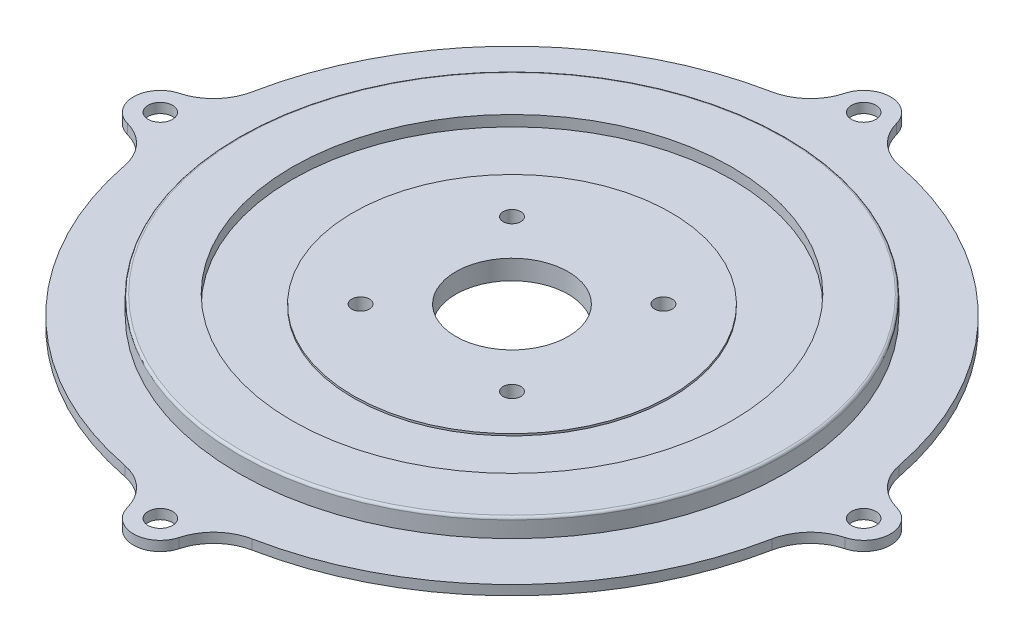
ISO-10303-21;
HEADER;
FILE_DESCRIPTION(('STEP AP214'),'2;1');
FILE_NAME('part.step','',(''),(''),'','','');
FILE_SCHEMA(('AUTOMOTIVE_DESIGN { 1 0 10303 214 1 1 1 1 }'));
ENDSEC;
DATA;
#1=APPLICATION_CONTEXT('core data for automotive mechanical design processes');
#2=APPLICATION_PROTOCOL_DEFINITION('international standard','automotive_design',2000,#1);
#3=PRODUCT_CONTEXT('',#1,'mechanical');
#4=PRODUCT('Part','Part','',(#3));
#5=PRODUCT_RELATED_PRODUCT_CATEGORY('part','',(#4));
#6=PRODUCT_DEFINITION_FORMATION('','',#4);
#7=PRODUCT_DEFINITION_CONTEXT('part definition',#1,'design');
#8=PRODUCT_DEFINITION('design','',#6,#7);
#9=PRODUCT_DEFINITION_SHAPE('','',#8);
#10=(LENGTH_UNIT() NAMED_UNIT(*) SI_UNIT(.MILLI.,.METRE.));
#11=(NAMED_UNIT(*) PLANE_ANGLE_UNIT() SI_UNIT($,.RADIAN.));
#12=(NAMED_UNIT(*) SI_UNIT($,.STERADIAN.) SOLID_ANGLE_UNIT());
#13=UNCERTAINTY_MEASURE_WITH_UNIT(LENGTH_MEASURE(1.E-05),#10,'distance_accuracy_value','');
#14=(GEOMETRIC_REPRESENTATION_CONTEXT(3) GLOBAL_UNCERTAINTY_ASSIGNED_CONTEXT((#13)) GLOBAL_UNIT_ASSIGNED_CONTEXT((#10,
#11,#12)) REPRESENTATION_CONTEXT('',''));
#15=CARTESIAN_POINT('',(0.,0.,0.));
#16=DIRECTION('',(0.,0.,1.));
#17=DIRECTION('',(1.,0.,0.));
#18=AXIS2_PLACEMENT_3D('',#15,#16,#17);
#19=CARTESIAN_POINT('',(0.,3.8,0.));
#20=DIRECTION('',(0.,1.,0.));
#21=DIRECTION('',(0.,0.,1.));
#22=AXIS2_PLACEMENT_3D('',#19,#20,#21);
#23=PLANE('',#22);
#24=CARTESIAN_POINT('',(0.,3.8,0.));
#25=DIRECTION('',(0.,1.,0.));
#26=DIRECTION('',(0.,0.,1.));
#27=AXIS2_PLACEMENT_3D('',#24,#25,#26);
#28=CIRCLE('',#27,55.5);
#29=CARTESIAN_POINT('',(0.,3.8,55.5));
#30=VERTEX_POINT('',#29);
#31=EDGE_CURVE('E12',#30,#30,#28,.T.);
#32=ORIENTED_EDGE('',*,*,#31,.T.);
#33=EDGE_LOOP('',(#32));
#34=FACE_BOUND('',#33,.T.);
#35=CARTESIAN_POINT('',(0.,3.8,0.));
#36=DIRECTION('',(0.,1.,0.));
#37=DIRECTION('',(0.,0.,1.));
#38=AXIS2_PLACEMENT_3D('',#35,#36,#37);
#39=CIRCLE('',#38,45.);
#40=CARTESIAN_POINT('',(0.,3.8,45.));
#41=VERTEX_POINT('',#40);
#42=EDGE_CURVE('E356',#41,#41,#39,.T.);
#43=ORIENTED_EDGE('',*,*,#42,.F.);
#44=EDGE_LOOP('',(#43));
#45=FACE_BOUND('',#44,.T.);
#46=ADVANCED_FACE('F44',(#34,#45),#23,.T.);
#47=CARTESIAN_POINT('',(0.,2.,0.));
#48=DIRECTION('',(0.,1.,0.));
#49=DIRECTION('',(0.,0.,1.));
#50=AXIS2_PLACEMENT_3D('',#47,#48,#49);
#51=PLANE('',#50);
#52=CARTESIAN_POINT('',(-15.5,2.,-15.5));
#53=DIRECTION('',(0.,1.,0.));
#54=DIRECTION('',(0.,0.,1.));
#55=AXIS2_PLACEMENT_3D('',#52,#53,#54);
#56=CIRCLE('',#55,1.8);
#57=CARTESIAN_POINT('',(-15.5,2.,-13.7));
#58=VERTEX_POINT('',#57);
#59=EDGE_CURVE('E511',#58,#58,#56,.T.);
#60=ORIENTED_EDGE('',*,*,#59,.F.);
#61=EDGE_LOOP('',(#60));
#62=FACE_BOUND('',#61,.T.);
#63=CARTESIAN_POINT('',(15.5,2.,-15.5));
#64=DIRECTION('',(0.,1.,0.));
#65=DIRECTION('',(0.,0.,1.));
#66=AXIS2_PLACEMENT_3D('',#63,#64,#65);
#67=CIRCLE('',#66,1.8);
#68=CARTESIAN_POINT('',(15.5,2.,-13.7));
#69=VERTEX_POINT('',#68);
#70=EDGE_CURVE('E512',#69,#69,#67,.T.);
#71=ORIENTED_EDGE('',*,*,#70,.F.);
#72=EDGE_LOOP('',(#71));
#73=FACE_BOUND('',#72,.T.);
#74=CARTESIAN_POINT('',(15.5,2.,15.5));
#75=DIRECTION('',(0.,1.,0.));
#76=DIRECTION('',(0.,0.,1.));
#77=AXIS2_PLACEMENT_3D('',#74,#75,#76);
#78=CIRCLE('',#77,1.8);
#79=CARTESIAN_POINT('',(15.5,2.,17.3));
#80=VERTEX_POINT('',#79);
#81=EDGE_CURVE('E520',#80,#80,#78,.T.);
#82=ORIENTED_EDGE('',*,*,#81,.F.);
#83=EDGE_LOOP('',(#82));
#84=FACE_BOUND('',#83,.T.);
#85=CARTESIAN_POINT('',(-15.5,2.,15.5));
#86=DIRECTION('',(0.,1.,0.));
#87=DIRECTION('',(0.,0.,1.));
#88=AXIS2_PLACEMENT_3D('',#85,#86,#87);
#89=CIRCLE('',#88,1.8);
#90=CARTESIAN_POINT('',(-15.5,2.,17.3));
#91=VERTEX_POINT('',#90);
#92=EDGE_CURVE('E528',#91,#91,#89,.T.);
#93=ORIENTED_EDGE('',*,*,#92,.F.);
#94=EDGE_LOOP('',(#93));
#95=FACE_BOUND('',#94,.T.);
#96=CARTESIAN_POINT('',(0.,2.,0.));
#97=DIRECTION('',(0.,1.,0.));
#98=DIRECTION('',(0.,0.,1.));
#99=AXIS2_PLACEMENT_3D('',#96,#97,#98);
#100=CIRCLE('',#99,11.5);
#101=CARTESIAN_POINT('',(0.,2.,11.5));
#102=VERTEX_POINT('',#101);
#103=EDGE_CURVE('E497',#102,#102,#100,.T.);
#104=ORIENTED_EDGE('',*,*,#103,.F.);
#105=EDGE_LOOP('',(#104));
#106=FACE_BOUND('',#105,.T.);
#107=CARTESIAN_POINT('',(0.,2.,0.));
#108=DIRECTION('',(0.,1.,0.));
#109=DIRECTION('',(0.,0.,1.));
#110=AXIS2_PLACEMENT_3D('',#107,#108,#109);
#111=CIRCLE('',#110,32.5);
#112=CARTESIAN_POINT('',(0.,2.,32.5));
#113=VERTEX_POINT('',#112);
#114=EDGE_CURVE('E359',#113,#113,#111,.T.);
#115=ORIENTED_EDGE('',*,*,#114,.T.);
#116=EDGE_LOOP('',(#115));
#117=FACE_BOUND('',#116,.T.);
#118=ADVANCED_FACE('F378',(#62,#73,#84,#95,#106,#117),#51,.T.);
#119=CARTESIAN_POINT('',(0.,-2.,0.));
#120=DIRECTION('',(0.,1.,0.));
#121=DIRECTION('',(0.,0.,1.));
#122=AXIS2_PLACEMENT_3D('',#119,#120,#121);
#123=CYLINDRICAL_SURFACE('',#122,67.5);
#124=DIRECTION('',(0.,-1.,0.));
#125=VECTOR('',#124,1.);
#126=CARTESIAN_POINT('',(13.0329760411852,0.,-66.2298387096775));
#127=LINE('',#126,#125);
#128=CARTESIAN_POINT('',(13.0329760411852,0.,-66.2298387096775));
#129=VERTEX_POINT('',#128);
#130=CARTESIAN_POINT('',(13.0329760411852,-2.,-66.2298387096775));
#131=VERTEX_POINT('',#130);
#132=EDGE_CURVE('E290',#129,#131,#127,.T.);
#133=ORIENTED_EDGE('',*,*,#132,.F.);
#134=CARTESIAN_POINT('',(0.,0.,0.));
#135=DIRECTION('',(0.,-1.,0.));
#136=DIRECTION('',(0.,0.,-1.));
#137=AXIS2_PLACEMENT_3D('',#134,#135,#136);
#138=CIRCLE('',#137,67.5);
#139=CARTESIAN_POINT('',(66.2298387096774,0.,-13.0329760411855));
#140=VERTEX_POINT('',#139);
#141=EDGE_CURVE('E332',#129,#140,#138,.T.);
#142=ORIENTED_EDGE('',*,*,#141,.T.);
#143=DIRECTION('',(0.,-1.,0.));
#144=VECTOR('',#143,1.);
#145=CARTESIAN_POINT('',(66.2298387096774,0.,-13.0329760411855));
#146=LINE('',#145,#144);
#147=CARTESIAN_POINT('',(66.2298387096774,-2.,-13.0329760411855));
#148=VERTEX_POINT('',#147);
#149=EDGE_CURVE('E328',#140,#148,#146,.T.);
#150=ORIENTED_EDGE('',*,*,#149,.T.);
#151=CARTESIAN_POINT('',(0.,-2.,0.));
#152=DIRECTION('',(0.,-1.,0.));
#153=DIRECTION('',(0.,0.,-1.));
#154=AXIS2_PLACEMENT_3D('',#151,#152,#153);
#155=CIRCLE('',#154,67.5);
#156=EDGE_CURVE('E348',#131,#148,#155,.T.);
#157=ORIENTED_EDGE('',*,*,#156,.F.);
#158=EDGE_LOOP('',(#133,#142,#150,#157));
#159=FACE_BOUND('',#158,.T.);
#160=ADVANCED_FACE('F383',(#159),#123,.T.);
#161=DIRECTION('',(0.,-1.,0.));
#162=VECTOR('',#161,1.);
#163=CARTESIAN_POINT('',(-13.0329760411848,0.,66.2298387096776));
#164=LINE('',#163,#162);
#165=CARTESIAN_POINT('',(-13.0329760411848,0.,66.2298387096776));
#166=VERTEX_POINT('',#165);
#167=CARTESIAN_POINT('',(-13.0329760411848,-2.,66.2298387096776));
#168=VERTEX_POINT('',#167);
#169=EDGE_CURVE('E207',#166,#168,#164,.T.);
#170=ORIENTED_EDGE('',*,*,#169,.F.);
#171=CARTESIAN_POINT('',(-66.2298387096774,0.,13.0329760411855));
#172=VERTEX_POINT('',#171);
#173=EDGE_CURVE('E352',#166,#172,#138,.T.);
#174=ORIENTED_EDGE('',*,*,#173,.T.);
#175=DIRECTION('',(0.,-1.,0.));
#176=VECTOR('',#175,1.);
#177=CARTESIAN_POINT('',(-66.2298387096774,0.,13.0329760411855));
#178=LINE('',#177,#176);
#179=CARTESIAN_POINT('',(-66.2298387096774,-2.,13.0329760411855));
#180=VERTEX_POINT('',#179);
#181=EDGE_CURVE('E68',#172,#180,#178,.T.);
#182=ORIENTED_EDGE('',*,*,#181,.T.);
#183=EDGE_CURVE('E347',#168,#180,#155,.T.);
#184=ORIENTED_EDGE('',*,*,#183,.F.);
#185=EDGE_LOOP('',(#170,#174,#182,#184));
#186=FACE_BOUND('',#185,.T.);
#187=ADVANCED_FACE('F603',(#186),#123,.T.);
#188=CARTESIAN_POINT('',(-66.2298387096774,0.,-13.0329760411855));
#189=VERTEX_POINT('',#188);
#190=CARTESIAN_POINT('',(-13.0329760411857,0.,-66.2298387096774));
#191=VERTEX_POINT('',#190);
#192=EDGE_CURVE('E596',#189,#191,#138,.T.);
#193=ORIENTED_EDGE('',*,*,#192,.T.);
#194=DIRECTION('',(0.,-1.,0.));
#195=VECTOR('',#194,1.);
#196=CARTESIAN_POINT('',(-13.0329760411857,0.,-66.2298387096774));
#197=LINE('',#196,#195);
#198=CARTESIAN_POINT('',(-13.0329760411857,-2.,-66.2298387096774));
#199=VERTEX_POINT('',#198);
#200=EDGE_CURVE('E285',#191,#199,#197,.T.);
#201=ORIENTED_EDGE('',*,*,#200,.T.);
#202=CARTESIAN_POINT('',(-66.2298387096774,-2.,-13.0329760411855));
#203=VERTEX_POINT('',#202);
#204=EDGE_CURVE('E589',#203,#199,#155,.T.);
#205=ORIENTED_EDGE('',*,*,#204,.F.);
#206=DIRECTION('',(0.,-1.,0.));
#207=VECTOR('',#206,1.);
#208=CARTESIAN_POINT('',(-66.2298387096774,0.,-13.0329760411855));
#209=LINE('',#208,#207);
#210=EDGE_CURVE('E248',#189,#203,#209,.T.);
#211=ORIENTED_EDGE('',*,*,#210,.F.);
#212=EDGE_LOOP('',(#193,#201,#205,#211));
#213=FACE_BOUND('',#212,.T.);
#214=ADVANCED_FACE('F391',(#213),#123,.T.);
#215=CARTESIAN_POINT('',(0.,10.,0.));
#216=DIRECTION('',(0.,-1.,0.));
#217=DIRECTION('',(0.,0.,-1.));
#218=AXIS2_PLACEMENT_3D('',#215,#216,#217);
#219=CYLINDRICAL_SURFACE('',#218,56.);
#220=CARTESIAN_POINT('',(0.,3.3,0.));
#221=DIRECTION('',(0.,1.,0.));
#222=DIRECTION('',(0.,0.,1.));
#223=AXIS2_PLACEMENT_3D('',#220,#221,#222);
#224=CIRCLE('',#223,56.);
#225=CARTESIAN_POINT('',(0.,3.3,56.));
#226=VERTEX_POINT('',#225);
#227=EDGE_CURVE('E53',#226,#226,#224,.F.);
#228=ORIENTED_EDGE('',*,*,#227,.T.);
#229=EDGE_LOOP('',(#228));
#230=FACE_BOUND('',#229,.T.);
#231=CARTESIAN_POINT('',(0.,0.,0.));
#232=DIRECTION('',(0.,1.,0.));
#233=DIRECTION('',(0.,0.,1.));
#234=AXIS2_PLACEMENT_3D('',#231,#232,#233);
#235=CIRCLE('',#234,56.);
#236=CARTESIAN_POINT('',(0.,0.,56.));
#237=VERTEX_POINT('',#236);
#238=EDGE_CURVE('E346',#237,#237,#235,.T.);
#239=ORIENTED_EDGE('',*,*,#238,.T.);
#240=EDGE_LOOP('',(#239));
#241=FACE_BOUND('',#240,.T.);
#242=ADVANCED_FACE('F364',(#230,#241),#219,.T.);
#243=CARTESIAN_POINT('',(66.2298387096774,0.,13.0329760411855));
#244=VERTEX_POINT('',#243);
#245=CARTESIAN_POINT('',(13.0329760411862,0.,66.2298387096773));
#246=VERTEX_POINT('',#245);
#247=EDGE_CURVE('E349',#244,#246,#138,.T.);
#248=ORIENTED_EDGE('',*,*,#247,.T.);
#249=DIRECTION('',(0.,-1.,0.));
#250=VECTOR('',#249,1.);
#251=CARTESIAN_POINT('',(13.0329760411862,0.,66.2298387096773));
#252=LINE('',#251,#250);
#253=CARTESIAN_POINT('',(13.0329760411862,-2.,66.2298387096773));
#254=VERTEX_POINT('',#253);
#255=EDGE_CURVE('E186',#246,#254,#252,.T.);
#256=ORIENTED_EDGE('',*,*,#255,.T.);
#257=CARTESIAN_POINT('',(66.2298387096774,-2.,13.0329760411855));
#258=VERTEX_POINT('',#257);
#259=EDGE_CURVE('E342',#258,#254,#155,.T.);
#260=ORIENTED_EDGE('',*,*,#259,.F.);
#261=DIRECTION('',(0.,-1.,0.));
#262=VECTOR('',#261,1.);
#263=CARTESIAN_POINT('',(66.2298387096774,0.,13.0329760411855));
#264=LINE('',#263,#262);
#265=EDGE_CURVE('E333',#244,#258,#264,.T.);
#266=ORIENTED_EDGE('',*,*,#265,.F.);
#267=EDGE_LOOP('',(#248,#256,#260,#266));
#268=FACE_BOUND('',#267,.T.);
#269=ADVANCED_FACE('F390',(#268),#123,.T.);
#270=CARTESIAN_POINT('',(0.,-2.,0.));
#271=DIRECTION('',(0.,-1.,0.));
#272=DIRECTION('',(0.,0.,-1.));
#273=AXIS2_PLACEMENT_3D('',#270,#271,#272);
#274=PLANE('',#273);
#275=CARTESIAN_POINT('',(0.,-2.,0.));
#276=DIRECTION('',(0.,1.,0.));
#277=DIRECTION('',(0.,0.,1.));
#278=AXIS2_PLACEMENT_3D('',#275,#276,#277);
#279=CIRCLE('',#278,11.5);
#280=CARTESIAN_POINT('',(0.,-2.,11.5));
#281=VERTEX_POINT('',#280);
#282=EDGE_CURVE('E502',#281,#281,#279,.T.);
#283=ORIENTED_EDGE('',*,*,#282,.T.);
#284=EDGE_LOOP('',(#283));
#285=FACE_BOUND('',#284,.T.);
#286=CARTESIAN_POINT('',(-15.5,-2.,15.5));
#287=DIRECTION('',(0.,1.,0.));
#288=DIRECTION('',(0.,0.,1.));
#289=AXIS2_PLACEMENT_3D('',#286,#287,#288);
#290=CIRCLE('',#289,1.8);
#291=CARTESIAN_POINT('',(-15.5,-2.,17.3));
#292=VERTEX_POINT('',#291);
#293=EDGE_CURVE('E524',#292,#292,#290,.T.);
#294=ORIENTED_EDGE('',*,*,#293,.T.);
#295=EDGE_LOOP('',(#294));
#296=FACE_BOUND('',#295,.T.);
#297=CARTESIAN_POINT('',(15.5,-2.,15.5));
#298=DIRECTION('',(0.,1.,0.));
#299=DIRECTION('',(0.,0.,1.));
#300=AXIS2_PLACEMENT_3D('',#297,#298,#299);
#301=CIRCLE('',#300,1.8);
#302=CARTESIAN_POINT('',(15.5,-2.,17.3));
#303=VERTEX_POINT('',#302);
#304=EDGE_CURVE('E516',#303,#303,#301,.T.);
#305=ORIENTED_EDGE('',*,*,#304,.T.);
#306=EDGE_LOOP('',(#305));
#307=FACE_BOUND('',#306,.T.);
#308=CARTESIAN_POINT('',(15.5,-2.,-15.5));
#309=DIRECTION('',(0.,1.,0.));
#310=DIRECTION('',(0.,0.,1.));
#311=AXIS2_PLACEMENT_3D('',#308,#309,#310);
#312=CIRCLE('',#311,1.8);
#313=CARTESIAN_POINT('',(15.5,-2.,-13.7));
#314=VERTEX_POINT('',#313);
#315=EDGE_CURVE('E507',#314,#314,#312,.T.);
#316=ORIENTED_EDGE('',*,*,#315,.T.);
#317=EDGE_LOOP('',(#316));
#318=FACE_BOUND('',#317,.T.);
#319=CARTESIAN_POINT('',(-15.5,-2.,-15.5));
#320=DIRECTION('',(0.,1.,0.));
#321=DIRECTION('',(0.,0.,1.));
#322=AXIS2_PLACEMENT_3D('',#319,#320,#321);
#323=CIRCLE('',#322,1.8);
#324=CARTESIAN_POINT('',(-15.5,-2.,-13.7));
#325=VERTEX_POINT('',#324);
#326=EDGE_CURVE('E535',#325,#325,#323,.T.);
#327=ORIENTED_EDGE('',*,*,#326,.T.);
#328=EDGE_LOOP('',(#327));
#329=FACE_BOUND('',#328,.T.);
#330=ORIENTED_EDGE('',*,*,#156,.T.);
#331=CARTESIAN_POINT('',(76.0416666666667,-2.,-14.9637873065463));
#332=DIRECTION('',(0.,1.,0.));
#333=DIRECTION('',(0.,0.,1.));
#334=AXIS2_PLACEMENT_3D('',#331,#332,#333);
#335=CIRCLE('',#334,10.);
#336=CARTESIAN_POINT('',(73.4341397849462,-2.,-5.30973097974223));
#337=VERTEX_POINT('',#336);
#338=EDGE_CURVE('E302',#148,#337,#335,.T.);
#339=ORIENTED_EDGE('',*,*,#338,.T.);
#340=CARTESIAN_POINT('',(72.,-2.,0.));
#341=DIRECTION('',(0.,-1.,0.));
#342=DIRECTION('',(0.,0.,-1.));
#343=AXIS2_PLACEMENT_3D('',#340,#341,#342);
#344=CIRCLE('',#343,5.5);
#345=CARTESIAN_POINT('',(73.4341397849462,-2.,5.30973097974223));
#346=VERTEX_POINT('',#345);
#347=EDGE_CURVE('E322',#337,#346,#344,.T.);
#348=ORIENTED_EDGE('',*,*,#347,.T.);
#349=CARTESIAN_POINT('',(76.0416666666667,-2.,14.9637873065463));
#350=DIRECTION('',(0.,1.,0.));
#351=DIRECTION('',(0.,0.,-1.));
#352=AXIS2_PLACEMENT_3D('',#349,#350,#351);
#353=CIRCLE('',#352,10.);
#354=EDGE_CURVE('E311',#346,#258,#353,.T.);
#355=ORIENTED_EDGE('',*,*,#354,.T.);
#356=ORIENTED_EDGE('',*,*,#259,.T.);
#357=CARTESIAN_POINT('',(14.9637873065471,-2.,76.0416666666665));
#358=DIRECTION('',(0.,1.,0.));
#359=DIRECTION('',(-1.,0.,0.));
#360=AXIS2_PLACEMENT_3D('',#357,#358,#359);
#361=CIRCLE('',#360,10.);
#362=CARTESIAN_POINT('',(5.309730979743,-2.,73.4341397849462));
#363=VERTEX_POINT('',#362);
#364=EDGE_CURVE('E198',#254,#363,#361,.T.);
#365=ORIENTED_EDGE('',*,*,#364,.T.);
#366=CARTESIAN_POINT('',(7.54159969190117E-13,-2.,72.));
#367=DIRECTION('',(0.,-1.,0.));
#368=DIRECTION('',(1.,0.,0.));
#369=AXIS2_PLACEMENT_3D('',#366,#367,#368);
#370=CIRCLE('',#369,5.5);
#371=CARTESIAN_POINT('',(-5.30973097974146,-2.,73.4341397849463));
#372=VERTEX_POINT('',#371);
#373=EDGE_CURVE('E165',#363,#372,#370,.T.);
#374=ORIENTED_EDGE('',*,*,#373,.T.);
#375=CARTESIAN_POINT('',(-14.9637873065455,-2.,76.0416666666668));
#376=DIRECTION('',(0.,1.,0.));
#377=DIRECTION('',(1.,0.,0.));
#378=AXIS2_PLACEMENT_3D('',#375,#376,#377);
#379=CIRCLE('',#378,10.);
#380=EDGE_CURVE('E188',#372,#168,#379,.T.);
#381=ORIENTED_EDGE('',*,*,#380,.T.);
#382=ORIENTED_EDGE('',*,*,#183,.T.);
#383=CARTESIAN_POINT('',(-76.0416666666667,-2.,14.9637873065463));
#384=DIRECTION('',(0.,1.,0.));
#385=DIRECTION('',(0.,0.,-1.));
#386=AXIS2_PLACEMENT_3D('',#383,#384,#385);
#387=CIRCLE('',#386,10.);
#388=CARTESIAN_POINT('',(-73.4341397849462,-2.,5.30973097974223));
#389=VERTEX_POINT('',#388);
#390=EDGE_CURVE('E217',#180,#389,#387,.T.);
#391=ORIENTED_EDGE('',*,*,#390,.T.);
#392=CARTESIAN_POINT('',(-72.,-2.,0.));
#393=DIRECTION('',(0.,-1.,0.));
#394=DIRECTION('',(0.,0.,1.));
#395=AXIS2_PLACEMENT_3D('',#392,#393,#394);
#396=CIRCLE('',#395,5.5);
#397=CARTESIAN_POINT('',(-73.4341397849462,-2.,-5.30973097974223));
#398=VERTEX_POINT('',#397);
#399=EDGE_CURVE('E238',#389,#398,#396,.T.);
#400=ORIENTED_EDGE('',*,*,#399,.T.);
#401=CARTESIAN_POINT('',(-76.0416666666667,-2.,-14.9637873065463));
#402=DIRECTION('',(0.,1.,0.));
#403=DIRECTION('',(0.,0.,1.));
#404=AXIS2_PLACEMENT_3D('',#401,#402,#403);
#405=CIRCLE('',#404,10.);
#406=EDGE_CURVE('E226',#398,#203,#405,.T.);
#407=ORIENTED_EDGE('',*,*,#406,.T.);
#408=ORIENTED_EDGE('',*,*,#204,.T.);
#409=CARTESIAN_POINT('',(-14.9637873065465,-2.,-76.0416666666666));
#410=DIRECTION('',(0.,1.,0.));
#411=DIRECTION('',(1.,0.,0.));
#412=AXIS2_PLACEMENT_3D('',#409,#410,#411);
#413=CIRCLE('',#412,10.);
#414=CARTESIAN_POINT('',(-5.30973097974248,-2.,-73.4341397849462));
#415=VERTEX_POINT('',#414);
#416=EDGE_CURVE('E261',#199,#415,#413,.T.);
#417=ORIENTED_EDGE('',*,*,#416,.T.);
#418=CARTESIAN_POINT('',(-2.51386656396706E-13,-2.,-72.));
#419=DIRECTION('',(0.,-1.,0.));
#420=DIRECTION('',(-1.,0.,0.));
#421=AXIS2_PLACEMENT_3D('',#418,#419,#420);
#422=CIRCLE('',#421,5.5);
#423=CARTESIAN_POINT('',(5.30973097974197,-2.,-73.4341397849462));
#424=VERTEX_POINT('',#423);
#425=EDGE_CURVE('E280',#415,#424,#422,.T.);
#426=ORIENTED_EDGE('',*,*,#425,.T.);
#427=CARTESIAN_POINT('',(14.963787306546,-2.,-76.0416666666667));
#428=DIRECTION('',(0.,1.,0.));
#429=DIRECTION('',(-1.,0.,0.));
#430=AXIS2_PLACEMENT_3D('',#427,#428,#429);
#431=CIRCLE('',#430,10.);
#432=EDGE_CURVE('E60',#424,#131,#431,.T.);
#433=ORIENTED_EDGE('',*,*,#432,.T.);
#434=EDGE_LOOP('',(#330,#339,#348,#355,#356,#365,#374,#381,#382,#391,#400,#407,#408,#417,#426,#433));
#435=FACE_BOUND('',#434,.T.);
#436=CARTESIAN_POINT('',(72.,-2.,0.));
#437=DIRECTION('',(0.,-1.,0.));
#438=DIRECTION('',(0.,0.,-1.));
#439=AXIS2_PLACEMENT_3D('',#436,#437,#438);
#440=CIRCLE('',#439,2.49999999999999);
#441=CARTESIAN_POINT('',(72.,-2.,-2.49999999999999));
#442=VERTEX_POINT('',#441);
#443=EDGE_CURVE('E289',#442,#442,#440,.T.);
#444=ORIENTED_EDGE('',*,*,#443,.F.);
#445=EDGE_LOOP('',(#444));
#446=FACE_BOUND('',#445,.T.);
#447=CARTESIAN_POINT('',(7.54159969190117E-13,-2.,72.));
#448=DIRECTION('',(0.,-1.,0.));
#449=DIRECTION('',(1.,0.,0.));
#450=AXIS2_PLACEMENT_3D('',#447,#448,#449);
#451=CIRCLE('',#450,2.49999999999999);
#452=CARTESIAN_POINT('',(2.50000000000075,-2.,72.));
#453=VERTEX_POINT('',#452);
#454=EDGE_CURVE('E193',#453,#453,#451,.T.);
#455=ORIENTED_EDGE('',*,*,#454,.F.);
#456=EDGE_LOOP('',(#455));
#457=FACE_BOUND('',#456,.T.);
#458=CARTESIAN_POINT('',(-72.,-2.,0.));
#459=DIRECTION('',(0.,-1.,0.));
#460=DIRECTION('',(0.,0.,1.));
#461=AXIS2_PLACEMENT_3D('',#458,#459,#460);
#462=CIRCLE('',#461,2.49999999999999);
#463=CARTESIAN_POINT('',(-72.,-2.,2.49999999999999));
#464=VERTEX_POINT('',#463);
#465=EDGE_CURVE('E206',#464,#464,#462,.T.);
#466=ORIENTED_EDGE('',*,*,#465,.F.);
#467=EDGE_LOOP('',(#466));
#468=FACE_BOUND('',#467,.T.);
#469=CARTESIAN_POINT('',(-2.51386656396706E-13,-2.,-72.));
#470=DIRECTION('',(0.,-1.,0.));
#471=DIRECTION('',(-1.,0.,0.));
#472=AXIS2_PLACEMENT_3D('',#469,#470,#471);
#473=CIRCLE('',#472,2.49999999999999);
#474=CARTESIAN_POINT('',(-2.50000000000025,-2.,-72.));
#475=VERTEX_POINT('',#474);
#476=EDGE_CURVE('E247',#475,#475,#473,.T.);
#477=ORIENTED_EDGE('',*,*,#476,.F.);
#478=EDGE_LOOP('',(#477));
#479=FACE_BOUND('',#478,.T.);
#480=ADVANCED_FACE('F394',(#285,#296,#307,#318,#329,#435,#446,#457,#468,#479),#274,.T.);
#481=CARTESIAN_POINT('',(0.,0.,0.));
#482=DIRECTION('',(0.,-1.,0.));
#483=DIRECTION('',(0.,0.,-1.));
#484=AXIS2_PLACEMENT_3D('',#481,#482,#483);
#485=PLANE('',#484);
#486=ORIENTED_EDGE('',*,*,#247,.F.);
#487=CARTESIAN_POINT('',(76.0416666666667,0.,14.9637873065463));
#488=DIRECTION('',(0.,1.,0.));
#489=DIRECTION('',(0.,0.,-1.));
#490=AXIS2_PLACEMENT_3D('',#487,#488,#489);
#491=CIRCLE('',#490,10.);
#492=CARTESIAN_POINT('',(73.4341397849462,0.,5.30973097974223));
#493=VERTEX_POINT('',#492);
#494=EDGE_CURVE('E315',#493,#244,#491,.T.);
#495=ORIENTED_EDGE('',*,*,#494,.F.);
#496=CARTESIAN_POINT('',(72.,0.,0.));
#497=DIRECTION('',(0.,-1.,0.));
#498=DIRECTION('',(0.,0.,-1.));
#499=AXIS2_PLACEMENT_3D('',#496,#497,#498);
#500=CIRCLE('',#499,5.5);
#501=CARTESIAN_POINT('',(73.4341397849462,0.,-5.30973097974223));
#502=VERTEX_POINT('',#501);
#503=EDGE_CURVE('E310',#502,#493,#500,.T.);
#504=ORIENTED_EDGE('',*,*,#503,.F.);
#505=CARTESIAN_POINT('',(76.0416666666667,0.,-14.9637873065463));
#506=DIRECTION('',(0.,1.,0.));
#507=DIRECTION('',(0.,0.,1.));
#508=AXIS2_PLACEMENT_3D('',#505,#506,#507);
#509=CIRCLE('',#508,10.);
#510=EDGE_CURVE('E306',#140,#502,#509,.T.);
#511=ORIENTED_EDGE('',*,*,#510,.F.);
#512=ORIENTED_EDGE('',*,*,#141,.F.);
#513=CARTESIAN_POINT('',(14.963787306546,0.,-76.0416666666667));
#514=DIRECTION('',(0.,1.,0.));
#515=DIRECTION('',(-1.,0.,0.));
#516=AXIS2_PLACEMENT_3D('',#513,#514,#515);
#517=CIRCLE('',#516,10.);
#518=CARTESIAN_POINT('',(5.30973097974197,0.,-73.4341397849462));
#519=VERTEX_POINT('',#518);
#520=EDGE_CURVE('E273',#519,#129,#517,.T.);
#521=ORIENTED_EDGE('',*,*,#520,.F.);
#522=CARTESIAN_POINT('',(-2.51386656396706E-13,0.,-72.));
#523=DIRECTION('',(0.,-1.,0.));
#524=DIRECTION('',(-1.,0.,0.));
#525=AXIS2_PLACEMENT_3D('',#522,#523,#524);
#526=CIRCLE('',#525,5.5);
#527=CARTESIAN_POINT('',(-5.30973097974248,0.,-73.4341397849462));
#528=VERTEX_POINT('',#527);
#529=EDGE_CURVE('E269',#528,#519,#526,.T.);
#530=ORIENTED_EDGE('',*,*,#529,.F.);
#531=CARTESIAN_POINT('',(-14.9637873065465,0.,-76.0416666666666));
#532=DIRECTION('',(0.,1.,0.));
#533=DIRECTION('',(1.,0.,0.));
#534=AXIS2_PLACEMENT_3D('',#531,#532,#533);
#535=CIRCLE('',#534,10.);
#536=EDGE_CURVE('E265',#191,#528,#535,.T.);
#537=ORIENTED_EDGE('',*,*,#536,.F.);
#538=ORIENTED_EDGE('',*,*,#192,.F.);
#539=CARTESIAN_POINT('',(-76.0416666666667,0.,-14.9637873065463));
#540=DIRECTION('',(0.,1.,0.));
#541=DIRECTION('',(0.,0.,1.));
#542=AXIS2_PLACEMENT_3D('',#539,#540,#541);
#543=CIRCLE('',#542,10.);
#544=CARTESIAN_POINT('',(-73.4341397849462,0.,-5.30973097974223));
#545=VERTEX_POINT('',#544);
#546=EDGE_CURVE('E230',#545,#189,#543,.T.);
#547=ORIENTED_EDGE('',*,*,#546,.F.);
#548=CARTESIAN_POINT('',(-72.,0.,0.));
#549=DIRECTION('',(0.,-1.,0.));
#550=DIRECTION('',(0.,0.,1.));
#551=AXIS2_PLACEMENT_3D('',#548,#549,#550);
#552=CIRCLE('',#551,5.5);
#553=CARTESIAN_POINT('',(-73.4341397849462,0.,5.30973097974223));
#554=VERTEX_POINT('',#553);
#555=EDGE_CURVE('E225',#554,#545,#552,.T.);
#556=ORIENTED_EDGE('',*,*,#555,.F.);
#557=CARTESIAN_POINT('',(-76.0416666666667,0.,14.9637873065463));
#558=DIRECTION('',(0.,1.,0.));
#559=DIRECTION('',(0.,0.,-1.));
#560=AXIS2_PLACEMENT_3D('',#557,#558,#559);
#561=CIRCLE('',#560,10.);
#562=EDGE_CURVE('E221',#172,#554,#561,.T.);
#563=ORIENTED_EDGE('',*,*,#562,.F.);
#564=ORIENTED_EDGE('',*,*,#173,.F.);
#565=CARTESIAN_POINT('',(-14.9637873065455,0.,76.0416666666668));
#566=DIRECTION('',(0.,1.,0.));
#567=DIRECTION('',(1.,0.,0.));
#568=AXIS2_PLACEMENT_3D('',#565,#566,#567);
#569=CIRCLE('',#568,10.);
#570=CARTESIAN_POINT('',(-5.30973097974146,0.,73.4341397849463));
#571=VERTEX_POINT('',#570);
#572=EDGE_CURVE('E171',#571,#166,#569,.T.);
#573=ORIENTED_EDGE('',*,*,#572,.F.);
#574=CARTESIAN_POINT('',(7.54159969190117E-13,0.,72.));
#575=DIRECTION('',(0.,-1.,0.));
#576=DIRECTION('',(1.,0.,0.));
#577=AXIS2_PLACEMENT_3D('',#574,#575,#576);
#578=CIRCLE('',#577,5.5);
#579=CARTESIAN_POINT('',(5.309730979743,0.,73.4341397849462));
#580=VERTEX_POINT('',#579);
#581=EDGE_CURVE('E163',#580,#571,#578,.T.);
#582=ORIENTED_EDGE('',*,*,#581,.F.);
#583=CARTESIAN_POINT('',(14.9637873065471,0.,76.0416666666665));
#584=DIRECTION('',(0.,1.,0.));
#585=DIRECTION('',(-1.,0.,0.));
#586=AXIS2_PLACEMENT_3D('',#583,#584,#585);
#587=CIRCLE('',#586,10.);
#588=EDGE_CURVE('E179',#246,#580,#587,.T.);
#589=ORIENTED_EDGE('',*,*,#588,.F.);
#590=EDGE_LOOP('',(#486,#495,#504,#511,#512,#521,#530,#537,#538,#547,#556,#563,#564,#573,#582,#589));
#591=FACE_BOUND('',#590,.T.);
#592=ORIENTED_EDGE('',*,*,#238,.F.);
#593=EDGE_LOOP('',(#592));
#594=FACE_BOUND('',#593,.T.);
#595=CARTESIAN_POINT('',(72.,0.,0.));
#596=DIRECTION('',(0.,-1.,0.));
#597=DIRECTION('',(0.,0.,-1.));
#598=AXIS2_PLACEMENT_3D('',#595,#596,#597);
#599=CIRCLE('',#598,2.49999999999999);
#600=CARTESIAN_POINT('',(72.,0.,-2.49999999999999));
#601=VERTEX_POINT('',#600);
#602=EDGE_CURVE('E298',#601,#601,#599,.T.);
#603=ORIENTED_EDGE('',*,*,#602,.T.);
#604=EDGE_LOOP('',(#603));
#605=FACE_BOUND('',#604,.T.);
#606=CARTESIAN_POINT('',(7.54159969190117E-13,0.,72.));
#607=DIRECTION('',(0.,-1.,0.));
#608=DIRECTION('',(1.,0.,0.));
#609=AXIS2_PLACEMENT_3D('',#606,#607,#608);
#610=CIRCLE('',#609,2.49999999999999);
#611=CARTESIAN_POINT('',(2.50000000000075,0.,72.));
#612=VERTEX_POINT('',#611);
#613=EDGE_CURVE('E201',#612,#612,#610,.T.);
#614=ORIENTED_EDGE('',*,*,#613,.T.);
#615=EDGE_LOOP('',(#614));
#616=FACE_BOUND('',#615,.T.);
#617=CARTESIAN_POINT('',(-72.,0.,0.));
#618=DIRECTION('',(0.,-1.,0.));
#619=DIRECTION('',(0.,0.,1.));
#620=AXIS2_PLACEMENT_3D('',#617,#618,#619);
#621=CIRCLE('',#620,2.49999999999999);
#622=CARTESIAN_POINT('',(-72.,0.,2.49999999999999));
#623=VERTEX_POINT('',#622);
#624=EDGE_CURVE('E213',#623,#623,#621,.T.);
#625=ORIENTED_EDGE('',*,*,#624,.T.);
#626=EDGE_LOOP('',(#625));
#627=FACE_BOUND('',#626,.T.);
#628=CARTESIAN_POINT('',(-2.51386656396706E-13,0.,-72.));
#629=DIRECTION('',(0.,-1.,0.));
#630=DIRECTION('',(-1.,0.,0.));
#631=AXIS2_PLACEMENT_3D('',#628,#629,#630);
#632=CIRCLE('',#631,2.49999999999999);
#633=CARTESIAN_POINT('',(-2.50000000000025,0.,-72.));
#634=VERTEX_POINT('',#633);
#635=EDGE_CURVE('E257',#634,#634,#632,.T.);
#636=ORIENTED_EDGE('',*,*,#635,.T.);
#637=EDGE_LOOP('',(#636));
#638=FACE_BOUND('',#637,.T.);
#639=ADVANCED_FACE('F177',(#591,#594,#605,#616,#627,#638),#485,.F.);
#640=CARTESIAN_POINT('',(76.0416666666667,0.,-14.9637873065463));
#641=DIRECTION('',(0.,-1.,0.));
#642=DIRECTION('',(0.,0.,-1.));
#643=AXIS2_PLACEMENT_3D('',#640,#641,#642);
#644=CYLINDRICAL_SURFACE('',#643,10.);
#645=ORIENTED_EDGE('',*,*,#338,.F.);
#646=ORIENTED_EDGE('',*,*,#149,.F.);
#647=ORIENTED_EDGE('',*,*,#510,.T.);
#648=DIRECTION('',(0.,-1.,0.));
#649=VECTOR('',#648,1.);
#650=CARTESIAN_POINT('',(73.4341397849462,0.,-5.30973097974223));
#651=LINE('',#650,#649);
#652=EDGE_CURVE('E318',#502,#337,#651,.T.);
#653=ORIENTED_EDGE('',*,*,#652,.T.);
#654=EDGE_LOOP('',(#645,#646,#647,#653));
#655=FACE_BOUND('',#654,.T.);
#656=ADVANCED_FACE('F398',(#655),#644,.F.);
#657=CARTESIAN_POINT('',(76.0416666666667,0.,14.9637873065463));
#658=DIRECTION('',(0.,-1.,0.));
#659=DIRECTION('',(0.,0.,-1.));
#660=AXIS2_PLACEMENT_3D('',#657,#658,#659);
#661=CYLINDRICAL_SURFACE('',#660,10.);
#662=ORIENTED_EDGE('',*,*,#354,.F.);
#663=DIRECTION('',(0.,-1.,0.));
#664=VECTOR('',#663,1.);
#665=CARTESIAN_POINT('',(73.4341397849462,0.,5.30973097974223));
#666=LINE('',#665,#664);
#667=EDGE_CURVE('E337',#493,#346,#666,.T.);
#668=ORIENTED_EDGE('',*,*,#667,.F.);
#669=ORIENTED_EDGE('',*,*,#494,.T.);
#670=ORIENTED_EDGE('',*,*,#265,.T.);
#671=EDGE_LOOP('',(#662,#668,#669,#670));
#672=FACE_BOUND('',#671,.T.);
#673=ADVANCED_FACE('F404',(#672),#661,.F.);
#674=CARTESIAN_POINT('',(72.,0.,0.));
#675=DIRECTION('',(0.,-1.,0.));
#676=DIRECTION('',(0.,0.,-1.));
#677=AXIS2_PLACEMENT_3D('',#674,#675,#676);
#678=CYLINDRICAL_SURFACE('',#677,5.5);
#679=ORIENTED_EDGE('',*,*,#347,.F.);
#680=ORIENTED_EDGE('',*,*,#652,.F.);
#681=ORIENTED_EDGE('',*,*,#503,.T.);
#682=ORIENTED_EDGE('',*,*,#667,.T.);
#683=EDGE_LOOP('',(#679,#680,#681,#682));
#684=FACE_BOUND('',#683,.T.);
#685=ADVANCED_FACE('F406',(#684),#678,.T.);
#686=CARTESIAN_POINT('',(72.,0.,0.));
#687=DIRECTION('',(0.,-1.,0.));
#688=DIRECTION('',(0.,0.,-1.));
#689=AXIS2_PLACEMENT_3D('',#686,#687,#688);
#690=CYLINDRICAL_SURFACE('',#689,2.49999999999999);
#691=ORIENTED_EDGE('',*,*,#602,.F.);
#692=EDGE_LOOP('',(#691));
#693=FACE_BOUND('',#692,.T.);
#694=ORIENTED_EDGE('',*,*,#443,.T.);
#695=EDGE_LOOP('',(#694));
#696=FACE_BOUND('',#695,.T.);
#697=ADVANCED_FACE('F409',(#693,#696),#690,.F.);
#698=CARTESIAN_POINT('',(-72.,0.,0.));
#699=DIRECTION('',(0.,-1.,0.));
#700=DIRECTION('',(0.,0.,-1.));
#701=AXIS2_PLACEMENT_3D('',#698,#699,#700);
#702=CYLINDRICAL_SURFACE('',#701,2.49999999999999);
#703=ORIENTED_EDGE('',*,*,#624,.F.);
#704=EDGE_LOOP('',(#703));
#705=FACE_BOUND('',#704,.T.);
#706=ORIENTED_EDGE('',*,*,#465,.T.);
#707=EDGE_LOOP('',(#706));
#708=FACE_BOUND('',#707,.T.);
#709=ADVANCED_FACE('F416',(#705,#708),#702,.F.);
#710=CARTESIAN_POINT('',(-72.,0.,0.));
#711=DIRECTION('',(0.,-1.,0.));
#712=DIRECTION('',(0.,0.,-1.));
#713=AXIS2_PLACEMENT_3D('',#710,#711,#712);
#714=CYLINDRICAL_SURFACE('',#713,5.5);
#715=ORIENTED_EDGE('',*,*,#399,.F.);
#716=DIRECTION('',(0.,-1.,0.));
#717=VECTOR('',#716,1.);
#718=CARTESIAN_POINT('',(-73.4341397849462,0.,5.30973097974223));
#719=LINE('',#718,#717);
#720=EDGE_CURVE('E234',#554,#389,#719,.T.);
#721=ORIENTED_EDGE('',*,*,#720,.F.);
#722=ORIENTED_EDGE('',*,*,#555,.T.);
#723=DIRECTION('',(0.,-1.,0.));
#724=VECTOR('',#723,1.);
#725=CARTESIAN_POINT('',(-73.4341397849462,0.,-5.30973097974223));
#726=LINE('',#725,#724);
#727=EDGE_CURVE('E252',#545,#398,#726,.T.);
#728=ORIENTED_EDGE('',*,*,#727,.T.);
#729=EDGE_LOOP('',(#715,#721,#722,#728));
#730=FACE_BOUND('',#729,.T.);
#731=ADVANCED_FACE('F440',(#730),#714,.T.);
#732=CARTESIAN_POINT('',(-76.0416666666667,0.,14.9637873065463));
#733=DIRECTION('',(0.,-1.,0.));
#734=DIRECTION('',(0.,0.,-1.));
#735=AXIS2_PLACEMENT_3D('',#732,#733,#734);
#736=CYLINDRICAL_SURFACE('',#735,10.);
#737=ORIENTED_EDGE('',*,*,#390,.F.);
#738=ORIENTED_EDGE('',*,*,#181,.F.);
#739=ORIENTED_EDGE('',*,*,#562,.T.);
#740=ORIENTED_EDGE('',*,*,#720,.T.);
#741=EDGE_LOOP('',(#737,#738,#739,#740));
#742=FACE_BOUND('',#741,.T.);
#743=ADVANCED_FACE('F436',(#742),#736,.F.);
#744=CARTESIAN_POINT('',(-76.0416666666667,0.,-14.9637873065463));
#745=DIRECTION('',(0.,-1.,0.));
#746=DIRECTION('',(0.,0.,-1.));
#747=AXIS2_PLACEMENT_3D('',#744,#745,#746);
#748=CYLINDRICAL_SURFACE('',#747,10.);
#749=ORIENTED_EDGE('',*,*,#406,.F.);
#750=ORIENTED_EDGE('',*,*,#727,.F.);
#751=ORIENTED_EDGE('',*,*,#546,.T.);
#752=ORIENTED_EDGE('',*,*,#210,.T.);
#753=EDGE_LOOP('',(#749,#750,#751,#752));
#754=FACE_BOUND('',#753,.T.);
#755=ADVANCED_FACE('F439',(#754),#748,.F.);
#756=CARTESIAN_POINT('',(7.54159969190117E-13,0.,72.));
#757=DIRECTION('',(0.,-1.,0.));
#758=DIRECTION('',(0.,0.,-1.));
#759=AXIS2_PLACEMENT_3D('',#756,#757,#758);
#760=CYLINDRICAL_SURFACE('',#759,2.49999999999999);
#761=ORIENTED_EDGE('',*,*,#613,.F.);
#762=EDGE_LOOP('',(#761));
#763=FACE_BOUND('',#762,.T.);
#764=ORIENTED_EDGE('',*,*,#454,.T.);
#765=EDGE_LOOP('',(#764));
#766=FACE_BOUND('',#765,.T.);
#767=ADVANCED_FACE('F447',(#763,#766),#760,.F.);
#768=CARTESIAN_POINT('',(7.54159969190117E-13,0.,72.));
#769=DIRECTION('',(0.,-1.,0.));
#770=DIRECTION('',(0.,0.,-1.));
#771=AXIS2_PLACEMENT_3D('',#768,#769,#770);
#772=CYLINDRICAL_SURFACE('',#771,5.5);
#773=ORIENTED_EDGE('',*,*,#373,.F.);
#774=DIRECTION('',(0.,-1.,0.));
#775=VECTOR('',#774,1.);
#776=CARTESIAN_POINT('',(5.309730979743,0.,73.4341397849462));
#777=LINE('',#776,#775);
#778=EDGE_CURVE('E160',#580,#363,#777,.T.);
#779=ORIENTED_EDGE('',*,*,#778,.F.);
#780=ORIENTED_EDGE('',*,*,#581,.T.);
#781=DIRECTION('',(0.,-1.,0.));
#782=VECTOR('',#781,1.);
#783=CARTESIAN_POINT('',(-5.30973097974146,0.,73.4341397849463));
#784=LINE('',#783,#782);
#785=EDGE_CURVE('E170',#571,#372,#784,.T.);
#786=ORIENTED_EDGE('',*,*,#785,.T.);
#787=EDGE_LOOP('',(#773,#779,#780,#786));
#788=FACE_BOUND('',#787,.T.);
#789=ADVANCED_FACE('F162',(#788),#772,.T.);
#790=CARTESIAN_POINT('',(14.9637873065471,0.,76.0416666666665));
#791=DIRECTION('',(0.,-1.,0.));
#792=DIRECTION('',(0.,0.,-1.));
#793=AXIS2_PLACEMENT_3D('',#790,#791,#792);
#794=CYLINDRICAL_SURFACE('',#793,10.);
#795=ORIENTED_EDGE('',*,*,#364,.F.);
#796=ORIENTED_EDGE('',*,*,#255,.F.);
#797=ORIENTED_EDGE('',*,*,#588,.T.);
#798=ORIENTED_EDGE('',*,*,#778,.T.);
#799=EDGE_LOOP('',(#795,#796,#797,#798));
#800=FACE_BOUND('',#799,.T.);
#801=ADVANCED_FACE('F184',(#800),#794,.F.);
#802=CARTESIAN_POINT('',(-14.9637873065455,0.,76.0416666666668));
#803=DIRECTION('',(0.,-1.,0.));
#804=DIRECTION('',(0.,0.,-1.));
#805=AXIS2_PLACEMENT_3D('',#802,#803,#804);
#806=CYLINDRICAL_SURFACE('',#805,10.);
#807=ORIENTED_EDGE('',*,*,#380,.F.);
#808=ORIENTED_EDGE('',*,*,#785,.F.);
#809=ORIENTED_EDGE('',*,*,#572,.T.);
#810=ORIENTED_EDGE('',*,*,#169,.T.);
#811=EDGE_LOOP('',(#807,#808,#809,#810));
#812=FACE_BOUND('',#811,.T.);
#813=ADVANCED_FACE('F422',(#812),#806,.F.);
#814=CARTESIAN_POINT('',(-14.9637873065465,0.,-76.0416666666666));
#815=DIRECTION('',(0.,-1.,0.));
#816=DIRECTION('',(0.,0.,-1.));
#817=AXIS2_PLACEMENT_3D('',#814,#815,#816);
#818=CYLINDRICAL_SURFACE('',#817,10.);
#819=ORIENTED_EDGE('',*,*,#416,.F.);
#820=ORIENTED_EDGE('',*,*,#200,.F.);
#821=ORIENTED_EDGE('',*,*,#536,.T.);
#822=DIRECTION('',(0.,-1.,0.));
#823=VECTOR('',#822,1.);
#824=CARTESIAN_POINT('',(-5.30973097974248,0.,-73.4341397849462));
#825=LINE('',#824,#823);
#826=EDGE_CURVE('E276',#528,#415,#825,.T.);
#827=ORIENTED_EDGE('',*,*,#826,.T.);
#828=EDGE_LOOP('',(#819,#820,#821,#827));
#829=FACE_BOUND('',#828,.T.);
#830=ADVANCED_FACE('F418',(#829),#818,.F.);
#831=CARTESIAN_POINT('',(14.963787306546,0.,-76.0416666666667));
#832=DIRECTION('',(0.,-1.,0.));
#833=DIRECTION('',(0.,0.,-1.));
#834=AXIS2_PLACEMENT_3D('',#831,#832,#833);
#835=CYLINDRICAL_SURFACE('',#834,10.);
#836=ORIENTED_EDGE('',*,*,#432,.F.);
#837=DIRECTION('',(0.,-1.,0.));
#838=VECTOR('',#837,1.);
#839=CARTESIAN_POINT('',(5.30973097974197,0.,-73.4341397849462));
#840=LINE('',#839,#838);
#841=EDGE_CURVE('E293',#519,#424,#840,.T.);
#842=ORIENTED_EDGE('',*,*,#841,.F.);
#843=ORIENTED_EDGE('',*,*,#520,.T.);
#844=ORIENTED_EDGE('',*,*,#132,.T.);
#845=EDGE_LOOP('',(#836,#842,#843,#844));
#846=FACE_BOUND('',#845,.T.);
#847=ADVANCED_FACE('F421',(#846),#835,.F.);
#848=CARTESIAN_POINT('',(-2.51386656396706E-13,0.,-72.));
#849=DIRECTION('',(0.,-1.,0.));
#850=DIRECTION('',(0.,0.,-1.));
#851=AXIS2_PLACEMENT_3D('',#848,#849,#850);
#852=CYLINDRICAL_SURFACE('',#851,5.5);
#853=ORIENTED_EDGE('',*,*,#425,.F.);
#854=ORIENTED_EDGE('',*,*,#826,.F.);
#855=ORIENTED_EDGE('',*,*,#529,.T.);
#856=ORIENTED_EDGE('',*,*,#841,.T.);
#857=EDGE_LOOP('',(#853,#854,#855,#856));
#858=FACE_BOUND('',#857,.T.);
#859=ADVANCED_FACE('F424',(#858),#852,.T.);
#860=CARTESIAN_POINT('',(-2.51386656396706E-13,0.,-72.));
#861=DIRECTION('',(0.,-1.,0.));
#862=DIRECTION('',(0.,0.,-1.));
#863=AXIS2_PLACEMENT_3D('',#860,#861,#862);
#864=CYLINDRICAL_SURFACE('',#863,2.49999999999999);
#865=ORIENTED_EDGE('',*,*,#635,.F.);
#866=EDGE_LOOP('',(#865));
#867=FACE_BOUND('',#866,.T.);
#868=ORIENTED_EDGE('',*,*,#476,.T.);
#869=EDGE_LOOP('',(#868));
#870=FACE_BOUND('',#869,.T.);
#871=ADVANCED_FACE('F427',(#867,#870),#864,.F.);
#872=CARTESIAN_POINT('',(-15.5,-2.,-15.5));
#873=DIRECTION('',(0.,1.,0.));
#874=DIRECTION('',(0.,0.,1.));
#875=AXIS2_PLACEMENT_3D('',#872,#873,#874);
#876=CYLINDRICAL_SURFACE('',#875,1.8);
#877=ORIENTED_EDGE('',*,*,#326,.F.);
#878=EDGE_LOOP('',(#877));
#879=FACE_BOUND('',#878,.T.);
#880=ORIENTED_EDGE('',*,*,#59,.T.);
#881=EDGE_LOOP('',(#880));
#882=FACE_BOUND('',#881,.T.);
#883=ADVANCED_FACE('F434',(#879,#882),#876,.F.);
#884=CARTESIAN_POINT('',(15.5,-2.,-15.5));
#885=DIRECTION('',(0.,1.,0.));
#886=DIRECTION('',(0.,0.,1.));
#887=AXIS2_PLACEMENT_3D('',#884,#885,#886);
#888=CYLINDRICAL_SURFACE('',#887,1.8);
#889=ORIENTED_EDGE('',*,*,#315,.F.);
#890=EDGE_LOOP('',(#889));
#891=FACE_BOUND('',#890,.T.);
#892=ORIENTED_EDGE('',*,*,#70,.T.);
#893=EDGE_LOOP('',(#892));
#894=FACE_BOUND('',#893,.T.);
#895=ADVANCED_FACE('F464',(#891,#894),#888,.F.);
#896=CARTESIAN_POINT('',(15.5,-2.,15.5));
#897=DIRECTION('',(0.,1.,0.));
#898=DIRECTION('',(0.,0.,1.));
#899=AXIS2_PLACEMENT_3D('',#896,#897,#898);
#900=CYLINDRICAL_SURFACE('',#899,1.8);
#901=ORIENTED_EDGE('',*,*,#304,.F.);
#902=EDGE_LOOP('',(#901));
#903=FACE_BOUND('',#902,.T.);
#904=ORIENTED_EDGE('',*,*,#81,.T.);
#905=EDGE_LOOP('',(#904));
#906=FACE_BOUND('',#905,.T.);
#907=ADVANCED_FACE('F474',(#903,#906),#900,.F.);
#908=CARTESIAN_POINT('',(-15.5,-2.,15.5));
#909=DIRECTION('',(0.,1.,0.));
#910=DIRECTION('',(0.,0.,1.));
#911=AXIS2_PLACEMENT_3D('',#908,#909,#910);
#912=CYLINDRICAL_SURFACE('',#911,1.8);
#913=ORIENTED_EDGE('',*,*,#293,.F.);
#914=EDGE_LOOP('',(#913));
#915=FACE_BOUND('',#914,.T.);
#916=ORIENTED_EDGE('',*,*,#92,.T.);
#917=EDGE_LOOP('',(#916));
#918=FACE_BOUND('',#917,.T.);
#919=ADVANCED_FACE('F470',(#915,#918),#912,.F.);
#920=CARTESIAN_POINT('',(0.,-2.,0.));
#921=DIRECTION('',(0.,1.,0.));
#922=DIRECTION('',(0.,0.,1.));
#923=AXIS2_PLACEMENT_3D('',#920,#921,#922);
#924=CYLINDRICAL_SURFACE('',#923,11.5);
#925=ORIENTED_EDGE('',*,*,#282,.F.);
#926=EDGE_LOOP('',(#925));
#927=FACE_BOUND('',#926,.T.);
#928=ORIENTED_EDGE('',*,*,#103,.T.);
#929=EDGE_LOOP('',(#928));
#930=FACE_BOUND('',#929,.T.);
#931=ADVANCED_FACE('F466',(#927,#930),#924,.F.);
#932=CARTESIAN_POINT('',(0.,1.6,0.));
#933=DIRECTION('',(0.,1.,0.));
#934=DIRECTION('',(0.,0.,1.));
#935=AXIS2_PLACEMENT_3D('',#932,#933,#934);
#936=CYLINDRICAL_SURFACE('',#935,45.);
#937=CARTESIAN_POINT('',(0.,1.6,0.));
#938=DIRECTION('',(0.,1.,0.));
#939=DIRECTION('',(0.,0.,1.));
#940=AXIS2_PLACEMENT_3D('',#937,#938,#939);
#941=CIRCLE('',#940,45.);
#942=CARTESIAN_POINT('',(0.,1.6,45.));
#943=VERTEX_POINT('',#942);
#944=EDGE_CURVE('E495',#943,#943,#941,.T.);
#945=ORIENTED_EDGE('',*,*,#944,.F.);
#946=EDGE_LOOP('',(#945));
#947=FACE_BOUND('',#946,.T.);
#948=ORIENTED_EDGE('',*,*,#42,.T.);
#949=EDGE_LOOP('',(#948));
#950=FACE_BOUND('',#949,.T.);
#951=ADVANCED_FACE('F469',(#947,#950),#936,.F.);
#952=CARTESIAN_POINT('',(0.,1.6,0.));
#953=DIRECTION('',(0.,1.,0.));
#954=DIRECTION('',(0.,0.,1.));
#955=AXIS2_PLACEMENT_3D('',#952,#953,#954);
#956=PLANE('',#955);
#957=CARTESIAN_POINT('',(0.,1.6,0.));
#958=DIRECTION('',(0.,1.,0.));
#959=DIRECTION('',(0.,0.,1.));
#960=AXIS2_PLACEMENT_3D('',#957,#958,#959);
#961=CIRCLE('',#960,32.5);
#962=CARTESIAN_POINT('',(0.,1.6,32.5));
#963=VERTEX_POINT('',#962);
#964=EDGE_CURVE('E492',#963,#963,#961,.T.);
#965=ORIENTED_EDGE('',*,*,#964,.F.);
#966=EDGE_LOOP('',(#965));
#967=FACE_BOUND('',#966,.T.);
#968=ORIENTED_EDGE('',*,*,#944,.T.);
#969=EDGE_LOOP('',(#968));
#970=FACE_BOUND('',#969,.T.);
#971=ADVANCED_FACE('F373',(#967,#970),#956,.T.);
#972=CARTESIAN_POINT('',(0.,1.6,0.));
#973=DIRECTION('',(0.,1.,0.));
#974=DIRECTION('',(0.,0.,1.));
#975=AXIS2_PLACEMENT_3D('',#972,#973,#974);
#976=CYLINDRICAL_SURFACE('',#975,32.5);
#977=ORIENTED_EDGE('',*,*,#964,.T.);
#978=EDGE_LOOP('',(#977));
#979=FACE_BOUND('',#978,.T.);
#980=ORIENTED_EDGE('',*,*,#114,.F.);
#981=EDGE_LOOP('',(#980));
#982=FACE_BOUND('',#981,.T.);
#983=ADVANCED_FACE('F368',(#979,#982),#976,.T.);
#984=CARTESIAN_POINT('',(0.,3.3,0.));
#985=DIRECTION('',(0.,1.,0.));
#986=DIRECTION('',(0.,0.,1.));
#987=AXIS2_PLACEMENT_3D('',#984,#985,#986);
#988=TOROIDAL_SURFACE('',#987,55.5,0.5);
#989=ORIENTED_EDGE('',*,*,#31,.F.);
#990=EDGE_LOOP('',(#989));
#991=FACE_BOUND('',#990,.T.);
#992=ORIENTED_EDGE('',*,*,#227,.F.);
#993=EDGE_LOOP('',(#992));
#994=FACE_BOUND('',#993,.T.);
#995=ADVANCED_FACE('F46',(#991,#994),#988,.T.);
#996=CLOSED_SHELL('',(#46,#118,#160,#187,#214,#242,#269,#480,#639,#656,#673,#685,#697,#709,#731,
#743,#755,#767,#789,#801,#813,#830,#847,#859,#871,#883,#895,#907,#919,#931,#951,#971,#983,#995));
#997=MANIFOLD_SOLID_BREP('B2',#996);
#998=ADVANCED_BREP_SHAPE_REPRESENTATION('',(#18,#997),#14);
#999=SHAPE_DEFINITION_REPRESENTATION(#9,#998);
ENDSEC;
END-ISO-10303-21;
